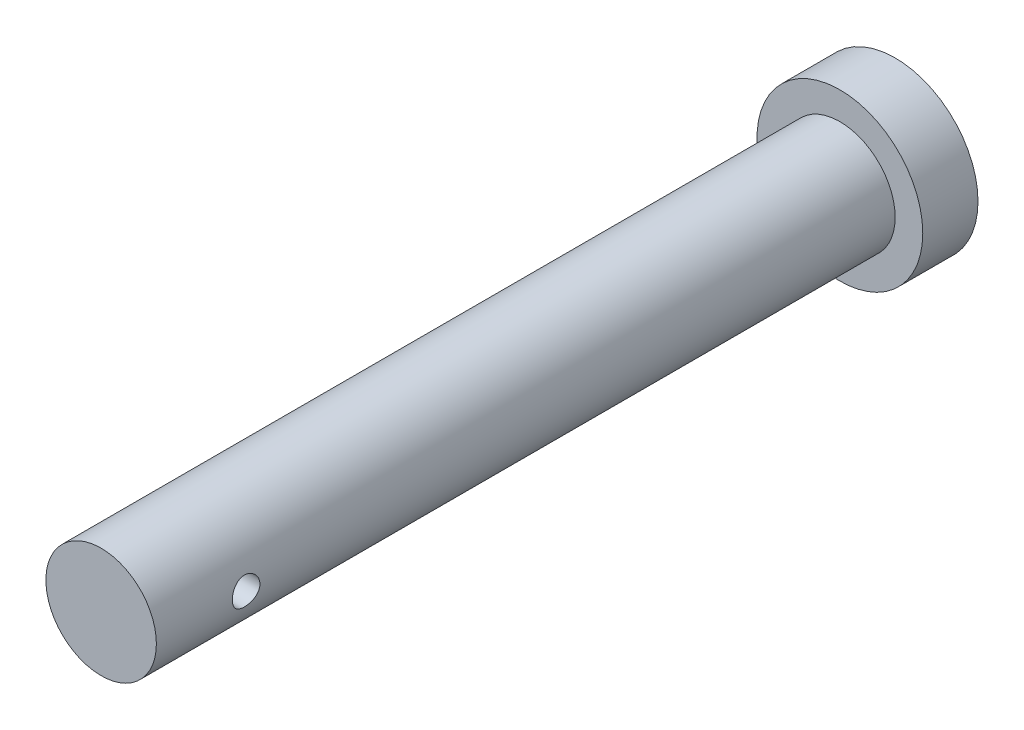
ISO-10303-21;
HEADER;
FILE_DESCRIPTION(('STEP AP214'),'2;1');
FILE_NAME('part.step','',(''),(''),'','','');
FILE_SCHEMA(('AUTOMOTIVE_DESIGN { 1 0 10303 214 1 1 1 1 }'));
ENDSEC;
DATA;
#1=APPLICATION_CONTEXT('core data for automotive mechanical design processes');
#2=APPLICATION_PROTOCOL_DEFINITION('international standard','automotive_design',2000,#1);
#3=PRODUCT_CONTEXT('',#1,'mechanical');
#4=PRODUCT('Part','Part','',(#3));
#5=PRODUCT_RELATED_PRODUCT_CATEGORY('part','',(#4));
#6=PRODUCT_DEFINITION_FORMATION('','',#4);
#7=PRODUCT_DEFINITION_CONTEXT('part definition',#1,'design');
#8=PRODUCT_DEFINITION('design','',#6,#7);
#9=PRODUCT_DEFINITION_SHAPE('','',#8);
#10=(LENGTH_UNIT() NAMED_UNIT(*) SI_UNIT(.MILLI.,.METRE.));
#11=(NAMED_UNIT(*) PLANE_ANGLE_UNIT() SI_UNIT($,.RADIAN.));
#12=(NAMED_UNIT(*) SI_UNIT($,.STERADIAN.) SOLID_ANGLE_UNIT());
#13=UNCERTAINTY_MEASURE_WITH_UNIT(LENGTH_MEASURE(1.E-05),#10,'distance_accuracy_value','');
#14=(GEOMETRIC_REPRESENTATION_CONTEXT(3) GLOBAL_UNCERTAINTY_ASSIGNED_CONTEXT((#13)) GLOBAL_UNIT_ASSIGNED_CONTEXT((#10,
#11,#12)) REPRESENTATION_CONTEXT('',''));
#15=CARTESIAN_POINT('',(0.,0.,0.));
#16=DIRECTION('',(0.,0.,1.));
#17=DIRECTION('',(1.,0.,0.));
#18=AXIS2_PLACEMENT_3D('',#15,#16,#17);
#19=CARTESIAN_POINT('',(0.,0.,115.));
#20=DIRECTION('',(0.,0.,-1.));
#21=DIRECTION('',(-1.,0.,0.));
#22=AXIS2_PLACEMENT_3D('',#19,#20,#21);
#23=CYLINDRICAL_SURFACE('',#22,8.);
#24=CARTESIAN_POINT('',(0.,0.,7.99999999999999));
#25=DIRECTION('',(0.,0.,1.));
#26=DIRECTION('',(1.,0.,0.));
#27=AXIS2_PLACEMENT_3D('',#24,#25,#26);
#28=CIRCLE('',#27,8.);
#29=CARTESIAN_POINT('',(8.,0.,7.99999999999999));
#30=VERTEX_POINT('',#29);
#31=EDGE_CURVE('E59',#30,#30,#28,.F.);
#32=ORIENTED_EDGE('',*,*,#31,.F.);
#33=EDGE_LOOP('',(#32));
#34=FACE_BOUND('',#33,.T.);
#35=CARTESIAN_POINT('',(0.,0.,115.));
#36=DIRECTION('',(0.,0.,1.));
#37=DIRECTION('',(1.,0.,0.));
#38=AXIS2_PLACEMENT_3D('',#35,#36,#37);
#39=CIRCLE('',#38,8.);
#40=CARTESIAN_POINT('',(8.,0.,115.));
#41=VERTEX_POINT('',#40);
#42=EDGE_CURVE('E98',#41,#41,#39,.T.);
#43=ORIENTED_EDGE('',*,*,#42,.F.);
#44=EDGE_LOOP('',(#43));
#45=FACE_BOUND('',#44,.T.);
#46=CARTESIAN_POINT('',(8.,0.,104.));
#47=CARTESIAN_POINT('',(7.9999981315735,-0.110501451559641,103.999996899016));
#48=CARTESIAN_POINT('',(7.99768770842435,-0.22103754377435,103.990811265635));
#49=CARTESIAN_POINT('',(7.98869485106526,-0.438941765027376,103.954366464924));
#50=CARTESIAN_POINT('',(7.98200993893301,-0.546308062494318,103.92709705395));
#51=CARTESIAN_POINT('',(7.96500835109376,-0.754694496243434,103.855414328717));
#52=CARTESIAN_POINT('',(7.95469603789411,-0.855722084573335,103.811021601713));
#53=CARTESIAN_POINT('',(7.93153791743495,-1.04889617587257,103.706424813274));
#54=CARTESIAN_POINT('',(7.91869202472208,-1.14104237913168,103.646220218508));
#55=CARTESIAN_POINT('',(7.89156551455591,-1.31573590306788,103.510398947128));
#56=CARTESIAN_POINT('',(7.87726276197502,-1.39807425341474,103.434517900055));
#57=CARTESIAN_POINT('',(7.84898160157249,-1.54899856960442,103.270063726788));
#58=CARTESIAN_POINT('',(7.83500323053157,-1.61758298259892,103.181489169404));
#59=CARTESIAN_POINT('',(7.80873034264225,-1.74003539039863,102.992539697684));
#60=CARTESIAN_POINT('',(7.79646392619748,-1.79366962123352,102.892009025588));
#61=CARTESIAN_POINT('',(7.77532659757355,-1.88319587806765,102.683002117787));
#62=CARTESIAN_POINT('',(7.76645514259225,-1.91909074058685,102.574527155557));
#63=CARTESIAN_POINT('',(7.7533396892843,-1.97140644907302,102.355008669064));
#64=CARTESIAN_POINT('',(7.74900654662681,-1.98820302444273,102.244060138616));
#65=CARTESIAN_POINT('',(7.74519149946122,-2.00301570008854,102.020841908001));
#66=CARTESIAN_POINT('',(7.74570880570571,-2.00103485575748,101.908572425744));
#67=CARTESIAN_POINT('',(7.75145607355756,-1.9786486995196,101.688778923006));
#68=CARTESIAN_POINT('',(7.75657150676392,-1.95869112025417,101.581205838046));
#69=CARTESIAN_POINT('',(7.77075612894759,-1.90163224920398,101.370985265452));
#70=CARTESIAN_POINT('',(7.77982559958985,-1.86452973609252,101.268338129295));
#71=CARTESIAN_POINT('',(7.80100151874212,-1.77385263724957,101.069682644997));
#72=CARTESIAN_POINT('',(7.81313769959755,-1.72011555631055,100.973751770947));
#73=CARTESIAN_POINT('',(7.83906281127988,-1.59780836801992,100.792108386991));
#74=CARTESIAN_POINT('',(7.85285203112837,-1.52923566507844,100.706397669244));
#75=CARTESIAN_POINT('',(7.88101174053188,-1.37688456624162,100.545061845741));
#76=CARTESIAN_POINT('',(7.89538759304001,-1.29272834422114,100.469794013252));
#77=CARTESIAN_POINT('',(7.92274620771675,-1.11281589000493,100.334371676715));
#78=CARTESIAN_POINT('',(7.93572892732543,-1.01705930361059,100.274217634315));
#79=CARTESIAN_POINT('',(7.95890309458921,-0.816154518241855,100.170599218367));
#80=CARTESIAN_POINT('',(7.96908480170303,-0.710975190944831,100.127192879661));
#81=CARTESIAN_POINT('',(7.98543889321888,-0.494501344190513,100.058776925721));
#82=CARTESIAN_POINT('',(7.99161204452374,-0.383207998867318,100.033763791442));
#83=CARTESIAN_POINT('',(7.999139990285,-0.160719960520042,100.003389912588));
#84=CARTESIAN_POINT('',(8.00061404677705,-0.0495956266509523,99.9975426318996));
#85=CARTESIAN_POINT('',(7.99891739752601,0.172043833068673,100.004332002741));
#86=CARTESIAN_POINT('',(7.99574710989128,0.282559012859456,100.016966990399));
#87=CARTESIAN_POINT('',(7.98519441503143,0.498152358368652,100.059961211189));
#88=CARTESIAN_POINT('',(7.97787512247748,0.603286825291669,100.090055017969));
#89=CARTESIAN_POINT('',(7.95984942178845,0.807009723270011,100.166809445371));
#90=CARTESIAN_POINT('',(7.94914267159856,0.905597492043508,100.213471739084));
#91=CARTESIAN_POINT('',(7.92524410568414,1.09536417923979,100.322981505166));
#92=CARTESIAN_POINT('',(7.91201156489243,1.18638058911443,100.386101483196));
#93=CARTESIAN_POINT('',(7.88459345583226,1.35670215152432,100.526386545063));
#94=CARTESIAN_POINT('',(7.87040772335606,1.43600527863067,100.603554052823));
#95=CARTESIAN_POINT('',(7.84225275947695,1.58265409076364,100.772002614459));
#96=CARTESIAN_POINT('',(7.82829738916375,1.6496584901627,100.863583604003));
#97=CARTESIAN_POINT('',(7.80257171169652,1.76734767868359,101.056976845954));
#98=CARTESIAN_POINT('',(7.79080130756035,1.81803319221058,101.158788643946));
#99=CARTESIAN_POINT('',(7.77090792979553,1.90126856081239,101.369207629884));
#100=CARTESIAN_POINT('',(7.76276340389208,1.93392586220542,101.477770171125));
#101=CARTESIAN_POINT('',(7.75102325453578,1.98046087993837,101.699079517185));
#102=CARTESIAN_POINT('',(7.74742663626582,1.99434270330487,101.811825401377));
#103=CARTESIAN_POINT('',(7.74526534938609,2.00271812044532,102.034828031807));
#104=CARTESIAN_POINT('',(7.74655910304352,1.99775719704016,102.145063246833));
#105=CARTESIAN_POINT('',(7.7537054534379,1.96983637108382,102.363071851557));
#106=CARTESIAN_POINT('',(7.75955795855809,1.94687683024902,102.470845290685));
#107=CARTESIAN_POINT('',(7.77508347576963,1.88390842592372,102.680277945421));
#108=CARTESIAN_POINT('',(7.78473353648412,1.84400187290717,102.78196974032));
#109=CARTESIAN_POINT('',(7.80677007633105,1.74835321814009,102.977287176952));
#110=CARTESIAN_POINT('',(7.81915693494364,1.69260892004558,103.070911697583));
#111=CARTESIAN_POINT('',(7.8456751235135,1.56515699818285,103.250072838669));
#112=CARTESIAN_POINT('',(7.8598435310901,1.49307088388301,103.335334764565));
#113=CARTESIAN_POINT('',(7.88810702995048,1.33571916158632,103.492729393061));
#114=CARTESIAN_POINT('',(7.90220210302746,1.2504504283482,103.564858973484));
#115=CARTESIAN_POINT('',(7.9290354086355,1.06729011560346,103.695215078086));
#116=CARTESIAN_POINT('',(7.94174444487824,0.969197896421854,103.753166151562));
#117=CARTESIAN_POINT('',(7.96406566633491,0.764354746013972,103.851663283921));
#118=CARTESIAN_POINT('',(7.97368006933042,0.657610084582322,103.892221814198));
#119=CARTESIAN_POINT('',(7.98730746087389,0.459213670991296,103.94876244044));
#120=CARTESIAN_POINT('',(7.9920344673692,0.368506894544091,103.967934990738));
#121=CARTESIAN_POINT('',(7.99838140309264,0.18520809538171,103.993554591496));
#122=CARTESIAN_POINT('',(8.00000156601192,0.0926162149901548,104.000002599074));
#123=CARTESIAN_POINT('',(8.,0.,104.));
#124=B_SPLINE_CURVE_WITH_KNOTS('',3,(#46,#47,#48,#49,#50,#51,#52,#53,#54,#55,#56,#57,#58,#59,
#60,#61,#62,#63,#64,#65,#66,#67,#68,#69,#70,#71,#72,#73,#74,#75,#76,#77,#78,#79,#80,#81,#82,#83,
#84,#85,#86,#87,#88,#89,#90,#91,#92,#93,#94,#95,#96,#97,#98,#99,#100,#101,#102,#103,#104,#105,
#106,#107,#108,#109,#110,#111,#112,#113,#114,#115,#116,#117,#118,#119,#120,#121,#122,#123),
.UNSPECIFIED.,.T.,.F.,(4,2,2,2,2,2,2,2,2,2,2,2,2,2,2,2,2,2,2,2,2,2,2,2,2,2,2,2,2,2,2,2,2,2,2,2,
2,2,4),(0.,0.331164949962519,0.662517650351865,0.993473203048145,1.32443992022576,
1.66152580582852,1.99864972773415,2.34078196727743,2.68285948225823,3.01808393468092,
3.3532538415469,3.68029996013785,4.00736937959145,4.337740371696,4.66816921119311,
5.00802001296453,5.34788119415423,5.68890972016578,6.0298729825595,6.36211078603461,
6.6943186815475,7.02160366023143,7.3489216976748,7.68204783424895,8.01523150681784,
8.35659345610394,8.69794025003769,9.03723006156475,9.37644564340969,9.70591707202574,
10.035381879458,10.3628853408369,10.6904342418696,11.0265276855097,11.3627009303165,
11.7049624733721,12.0469781843289,12.3245632392729,12.6021274139514),.UNSPECIFIED.);
#125=CARTESIAN_POINT('',(8.,0.,104.));
#126=VERTEX_POINT('',#125);
#127=EDGE_CURVE('E63',#126,#126,#124,.T.);
#128=ORIENTED_EDGE('',*,*,#127,.F.);
#129=EDGE_LOOP('',(#128));
#130=FACE_BOUND('',#129,.T.);
#131=CARTESIAN_POINT('',(-8.,0.,104.));
#132=CARTESIAN_POINT('',(-7.9999981315735,0.110501451559641,103.999996899016));
#133=CARTESIAN_POINT('',(-7.99768770842435,0.22103754377435,103.990811265635));
#134=CARTESIAN_POINT('',(-7.98869485106526,0.438941765027376,103.954366464924));
#135=CARTESIAN_POINT('',(-7.98200993893301,0.546308062494318,103.92709705395));
#136=CARTESIAN_POINT('',(-7.96500835109376,0.754694496243434,103.855414328717));
#137=CARTESIAN_POINT('',(-7.95469603789411,0.855722084573335,103.811021601713));
#138=CARTESIAN_POINT('',(-7.93153791743495,1.04889617587257,103.706424813274));
#139=CARTESIAN_POINT('',(-7.91869202472208,1.14104237913168,103.646220218508));
#140=CARTESIAN_POINT('',(-7.89156551455591,1.31573590306788,103.510398947128));
#141=CARTESIAN_POINT('',(-7.87726276197502,1.39807425341474,103.434517900055));
#142=CARTESIAN_POINT('',(-7.84898160157249,1.54899856960442,103.270063726788));
#143=CARTESIAN_POINT('',(-7.83500323053157,1.61758298259892,103.181489169404));
#144=CARTESIAN_POINT('',(-7.80873034264225,1.74003539039863,102.992539697684));
#145=CARTESIAN_POINT('',(-7.79646392619748,1.79366962123352,102.892009025588));
#146=CARTESIAN_POINT('',(-7.77532659757355,1.88319587806765,102.683002117787));
#147=CARTESIAN_POINT('',(-7.76645514259225,1.91909074058685,102.574527155557));
#148=CARTESIAN_POINT('',(-7.7533396892843,1.97140644907302,102.355008669064));
#149=CARTESIAN_POINT('',(-7.74900654662681,1.98820302444273,102.244060138616));
#150=CARTESIAN_POINT('',(-7.74519149946122,2.00301570008854,102.020841908001));
#151=CARTESIAN_POINT('',(-7.74570880570571,2.00103485575748,101.908572425744));
#152=CARTESIAN_POINT('',(-7.75145607355756,1.9786486995196,101.688778923006));
#153=CARTESIAN_POINT('',(-7.75657150676392,1.95869112025417,101.581205838046));
#154=CARTESIAN_POINT('',(-7.77075612894759,1.90163224920398,101.370985265452));
#155=CARTESIAN_POINT('',(-7.77982559958985,1.86452973609252,101.268338129295));
#156=CARTESIAN_POINT('',(-7.80100151874212,1.77385263724957,101.069682644997));
#157=CARTESIAN_POINT('',(-7.81313769959755,1.72011555631055,100.973751770947));
#158=CARTESIAN_POINT('',(-7.83906281127988,1.59780836801992,100.792108386991));
#159=CARTESIAN_POINT('',(-7.85285203112837,1.52923566507844,100.706397669244));
#160=CARTESIAN_POINT('',(-7.88101174053188,1.37688456624162,100.545061845741));
#161=CARTESIAN_POINT('',(-7.89538759304001,1.29272834422114,100.469794013252));
#162=CARTESIAN_POINT('',(-7.92274620771675,1.11281589000493,100.334371676715));
#163=CARTESIAN_POINT('',(-7.93572892732543,1.01705930361059,100.274217634315));
#164=CARTESIAN_POINT('',(-7.95890309458921,0.816154518241855,100.170599218367));
#165=CARTESIAN_POINT('',(-7.96908480170303,0.710975190944831,100.127192879661));
#166=CARTESIAN_POINT('',(-7.98543889321888,0.494501344190513,100.058776925721));
#167=CARTESIAN_POINT('',(-7.99161204452374,0.383207998867318,100.033763791442));
#168=CARTESIAN_POINT('',(-7.999139990285,0.160719960520042,100.003389912588));
#169=CARTESIAN_POINT('',(-8.00061404677705,0.0495956266509523,99.9975426318996));
#170=CARTESIAN_POINT('',(-7.99891739752601,-0.172043833068673,100.004332002741));
#171=CARTESIAN_POINT('',(-7.99574710989128,-0.282559012859456,100.016966990399));
#172=CARTESIAN_POINT('',(-7.98519441503143,-0.498152358368652,100.059961211189));
#173=CARTESIAN_POINT('',(-7.97787512247748,-0.603286825291669,100.090055017969));
#174=CARTESIAN_POINT('',(-7.95984942178845,-0.807009723270011,100.166809445371));
#175=CARTESIAN_POINT('',(-7.94914267159856,-0.905597492043508,100.213471739084));
#176=CARTESIAN_POINT('',(-7.92524410568414,-1.09536417923979,100.322981505166));
#177=CARTESIAN_POINT('',(-7.91201156489243,-1.18638058911443,100.386101483196));
#178=CARTESIAN_POINT('',(-7.88459345583226,-1.35670215152432,100.526386545063));
#179=CARTESIAN_POINT('',(-7.87040772335606,-1.43600527863067,100.603554052823));
#180=CARTESIAN_POINT('',(-7.84225275947695,-1.58265409076364,100.772002614459));
#181=CARTESIAN_POINT('',(-7.82829738916375,-1.6496584901627,100.863583604003));
#182=CARTESIAN_POINT('',(-7.80257171169652,-1.76734767868359,101.056976845954));
#183=CARTESIAN_POINT('',(-7.79080130756035,-1.81803319221058,101.158788643946));
#184=CARTESIAN_POINT('',(-7.77090792979553,-1.90126856081239,101.369207629884));
#185=CARTESIAN_POINT('',(-7.76276340389208,-1.93392586220542,101.477770171125));
#186=CARTESIAN_POINT('',(-7.75102325453578,-1.98046087993837,101.699079517185));
#187=CARTESIAN_POINT('',(-7.74742663626582,-1.99434270330487,101.811825401377));
#188=CARTESIAN_POINT('',(-7.74526534938609,-2.00271812044532,102.034828031807));
#189=CARTESIAN_POINT('',(-7.74655910304352,-1.99775719704016,102.145063246833));
#190=CARTESIAN_POINT('',(-7.7537054534379,-1.96983637108382,102.363071851557));
#191=CARTESIAN_POINT('',(-7.75955795855809,-1.94687683024902,102.470845290685));
#192=CARTESIAN_POINT('',(-7.77508347576963,-1.88390842592372,102.680277945421));
#193=CARTESIAN_POINT('',(-7.78473353648412,-1.84400187290717,102.78196974032));
#194=CARTESIAN_POINT('',(-7.80677007633105,-1.74835321814009,102.977287176952));
#195=CARTESIAN_POINT('',(-7.81915693494364,-1.69260892004558,103.070911697583));
#196=CARTESIAN_POINT('',(-7.8456751235135,-1.56515699818285,103.250072838669));
#197=CARTESIAN_POINT('',(-7.8598435310901,-1.49307088388301,103.335334764565));
#198=CARTESIAN_POINT('',(-7.88810702995048,-1.33571916158632,103.492729393061));
#199=CARTESIAN_POINT('',(-7.90220210302746,-1.2504504283482,103.564858973484));
#200=CARTESIAN_POINT('',(-7.9290354086355,-1.06729011560346,103.695215078086));
#201=CARTESIAN_POINT('',(-7.94174444487824,-0.969197896421854,103.753166151562));
#202=CARTESIAN_POINT('',(-7.96406566633491,-0.764354746013972,103.851663283921));
#203=CARTESIAN_POINT('',(-7.97368006933042,-0.657610084582322,103.892221814198));
#204=CARTESIAN_POINT('',(-7.98730746087389,-0.459213670991296,103.94876244044));
#205=CARTESIAN_POINT('',(-7.9920344673692,-0.368506894544091,103.967934990738));
#206=CARTESIAN_POINT('',(-7.99838140309264,-0.18520809538171,103.993554591496));
#207=CARTESIAN_POINT('',(-8.00000156601192,-0.0926162149901548,104.000002599074));
#208=CARTESIAN_POINT('',(-8.,0.,104.));
#209=B_SPLINE_CURVE_WITH_KNOTS('',3,(#131,#132,#133,#134,#135,#136,#137,#138,#139,#140,#141,
#142,#143,#144,#145,#146,#147,#148,#149,#150,#151,#152,#153,#154,#155,#156,#157,#158,#159,#160,
#161,#162,#163,#164,#165,#166,#167,#168,#169,#170,#171,#172,#173,#174,#175,#176,#177,#178,#179,
#180,#181,#182,#183,#184,#185,#186,#187,#188,#189,#190,#191,#192,#193,#194,#195,#196,#197,#198,
#199,#200,#201,#202,#203,#204,#205,#206,#207,#208),.UNSPECIFIED.,.T.,.F.,(4,2,2,2,2,2,2,2,2,2,2,
2,2,2,2,2,2,2,2,2,2,2,2,2,2,2,2,2,2,2,2,2,2,2,2,2,2,2,4),(0.,0.331164949962519,
0.662517650351865,0.993473203048145,1.32443992022576,1.66152580582852,1.99864972773415,
2.34078196727743,2.68285948225823,3.01808393468092,3.3532538415469,3.68029996013785,
4.00736937959145,4.337740371696,4.66816921119311,5.00802001296453,5.34788119415423,
5.68890972016578,6.0298729825595,6.36211078603461,6.6943186815475,7.02160366023143,
7.3489216976748,7.68204783424895,8.01523150681784,8.35659345610394,8.69794025003769,
9.03723006156475,9.37644564340969,9.70591707202574,10.035381879458,10.3628853408369,
10.6904342418696,11.0265276855097,11.3627009303165,11.7049624733721,12.0469781843289,
12.3245632392729,12.6021274139514),.UNSPECIFIED.);
#210=CARTESIAN_POINT('',(-8.,0.,104.));
#211=VERTEX_POINT('',#210);
#212=EDGE_CURVE('E43',#211,#211,#209,.T.);
#213=ORIENTED_EDGE('',*,*,#212,.F.);
#214=EDGE_LOOP('',(#213));
#215=FACE_BOUND('',#214,.T.);
#216=ADVANCED_FACE('F39',(#34,#45,#130,#215),#23,.T.);
#217=CARTESIAN_POINT('',(0.,0.,8.));
#218=DIRECTION('',(0.,0.,-1.));
#219=DIRECTION('',(-1.,0.,0.));
#220=AXIS2_PLACEMENT_3D('',#217,#218,#219);
#221=CYLINDRICAL_SURFACE('',#220,12.);
#222=CARTESIAN_POINT('',(0.,0.,8.));
#223=DIRECTION('',(0.,0.,1.));
#224=DIRECTION('',(1.,0.,0.));
#225=AXIS2_PLACEMENT_3D('',#222,#223,#224);
#226=CIRCLE('',#225,12.);
#227=CARTESIAN_POINT('',(12.,0.,8.));
#228=VERTEX_POINT('',#227);
#229=EDGE_CURVE('E10',#228,#228,#226,.T.);
#230=ORIENTED_EDGE('',*,*,#229,.F.);
#231=EDGE_LOOP('',(#230));
#232=FACE_BOUND('',#231,.T.);
#233=CARTESIAN_POINT('',(0.,0.,0.));
#234=DIRECTION('',(0.,0.,1.));
#235=DIRECTION('',(1.,0.,0.));
#236=AXIS2_PLACEMENT_3D('',#233,#234,#235);
#237=CIRCLE('',#236,12.);
#238=CARTESIAN_POINT('',(12.,0.,0.));
#239=VERTEX_POINT('',#238);
#240=EDGE_CURVE('E53',#239,#239,#237,.T.);
#241=ORIENTED_EDGE('',*,*,#240,.T.);
#242=EDGE_LOOP('',(#241));
#243=FACE_BOUND('',#242,.T.);
#244=ADVANCED_FACE('F41',(#232,#243),#221,.T.);
#245=CARTESIAN_POINT('',(0.,0.,8.));
#246=DIRECTION('',(0.,0.,1.));
#247=DIRECTION('',(1.,0.,0.));
#248=AXIS2_PLACEMENT_3D('',#245,#246,#247);
#249=PLANE('',#248);
#250=ORIENTED_EDGE('',*,*,#31,.T.);
#251=EDGE_LOOP('',(#250));
#252=FACE_BOUND('',#251,.T.);
#253=ORIENTED_EDGE('',*,*,#229,.T.);
#254=EDGE_LOOP('',(#253));
#255=FACE_BOUND('',#254,.T.);
#256=ADVANCED_FACE('F84',(#252,#255),#249,.T.);
#257=CARTESIAN_POINT('',(0.,0.,0.));
#258=DIRECTION('',(0.,0.,1.));
#259=DIRECTION('',(1.,0.,0.));
#260=AXIS2_PLACEMENT_3D('',#257,#258,#259);
#261=PLANE('',#260);
#262=ORIENTED_EDGE('',*,*,#240,.F.);
#263=EDGE_LOOP('',(#262));
#264=FACE_BOUND('',#263,.T.);
#265=ADVANCED_FACE('F79',(#264),#261,.F.);
#266=CARTESIAN_POINT('',(0.,0.,115.));
#267=DIRECTION('',(0.,0.,1.));
#268=DIRECTION('',(1.,0.,0.));
#269=AXIS2_PLACEMENT_3D('',#266,#267,#268);
#270=PLANE('',#269);
#271=ORIENTED_EDGE('',*,*,#42,.T.);
#272=EDGE_LOOP('',(#271));
#273=FACE_BOUND('',#272,.T.);
#274=ADVANCED_FACE('F75',(#273),#270,.T.);
#275=CARTESIAN_POINT('',(100.,0.,102.));
#276=DIRECTION('',(-1.,0.,0.));
#277=DIRECTION('',(0.,0.,1.));
#278=AXIS2_PLACEMENT_3D('',#275,#276,#277);
#279=CYLINDRICAL_SURFACE('',#278,2.);
#280=ORIENTED_EDGE('',*,*,#127,.T.);
#281=EDGE_LOOP('',(#280));
#282=FACE_BOUND('',#281,.T.);
#283=ORIENTED_EDGE('',*,*,#212,.T.);
#284=EDGE_LOOP('',(#283));
#285=FACE_BOUND('',#284,.T.);
#286=ADVANCED_FACE('F72',(#282,#285),#279,.F.);
#287=CLOSED_SHELL('',(#216,#244,#256,#265,#274,#286));
#288=MANIFOLD_SOLID_BREP('B2',#287);
#289=ADVANCED_BREP_SHAPE_REPRESENTATION('',(#18,#288),#14);
#290=SHAPE_DEFINITION_REPRESENTATION(#9,#289);
ENDSEC;
END-ISO-10303-21;
